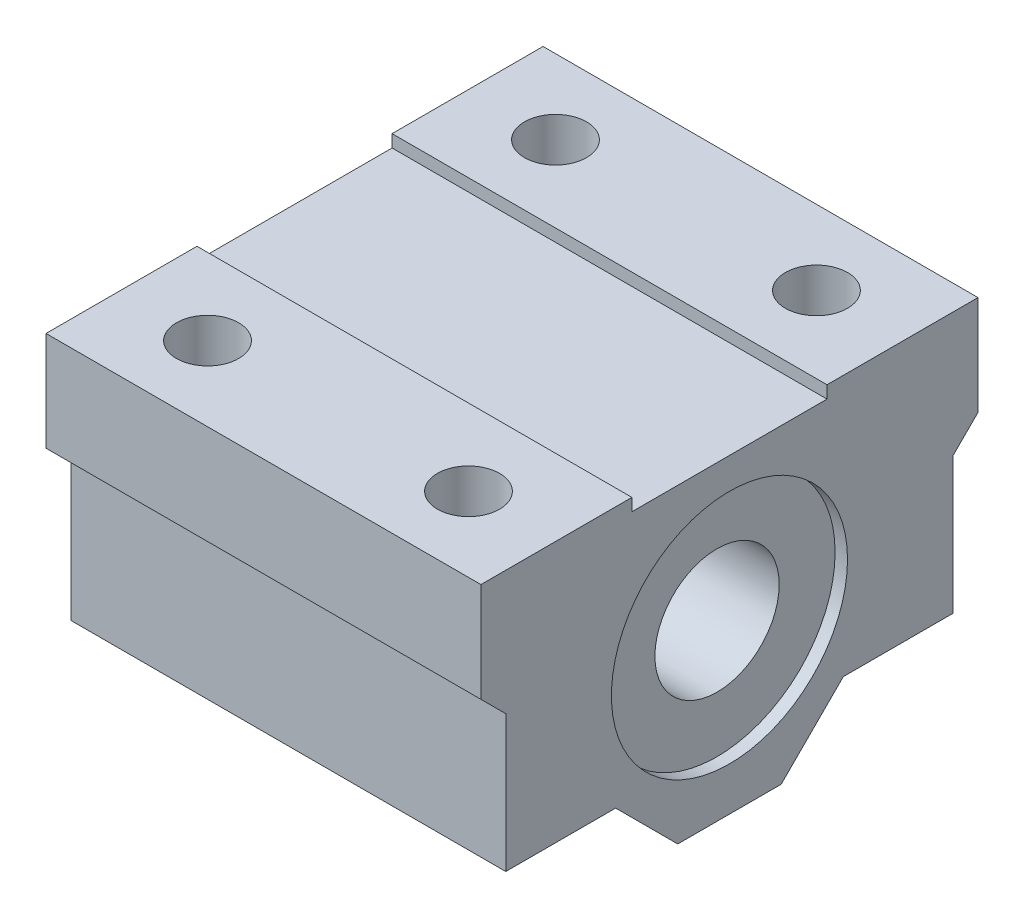
ISO-10303-21;
HEADER;
FILE_DESCRIPTION(('STEP AP214'),'2;1');
FILE_NAME('part.step','',(''),(''),'','','');
FILE_SCHEMA(('AUTOMOTIVE_DESIGN { 1 0 10303 214 1 1 1 1 }'));
ENDSEC;
DATA;
#1=APPLICATION_CONTEXT('core data for automotive mechanical design processes');
#2=APPLICATION_PROTOCOL_DEFINITION('international standard','automotive_design',2000,#1);
#3=PRODUCT_CONTEXT('',#1,'mechanical');
#4=PRODUCT('Part','Part','',(#3));
#5=PRODUCT_RELATED_PRODUCT_CATEGORY('part','',(#4));
#6=PRODUCT_DEFINITION_FORMATION('','',#4);
#7=PRODUCT_DEFINITION_CONTEXT('part definition',#1,'design');
#8=PRODUCT_DEFINITION('design','',#6,#7);
#9=PRODUCT_DEFINITION_SHAPE('','',#8);
#10=(LENGTH_UNIT() NAMED_UNIT(*) SI_UNIT(.MILLI.,.METRE.));
#11=(NAMED_UNIT(*) PLANE_ANGLE_UNIT() SI_UNIT($,.RADIAN.));
#12=(NAMED_UNIT(*) SI_UNIT($,.STERADIAN.) SOLID_ANGLE_UNIT());
#13=UNCERTAINTY_MEASURE_WITH_UNIT(LENGTH_MEASURE(1.E-05),#10,'distance_accuracy_value','');
#14=(GEOMETRIC_REPRESENTATION_CONTEXT(3) GLOBAL_UNCERTAINTY_ASSIGNED_CONTEXT((#13)) GLOBAL_UNIT_ASSIGNED_CONTEXT((#10,
#11,#12)) REPRESENTATION_CONTEXT('',''));
#15=CARTESIAN_POINT('',(0.,0.,0.));
#16=DIRECTION('',(0.,0.,1.));
#17=DIRECTION('',(1.,0.,0.));
#18=AXIS2_PLACEMENT_3D('',#15,#16,#17);
#19=CARTESIAN_POINT('',(17.5,13.,0.));
#20=DIRECTION('',(-1.,0.,0.));
#21=DIRECTION('',(0.,0.,1.));
#22=AXIS2_PLACEMENT_3D('',#19,#20,#21);
#23=CYLINDRICAL_SURFACE('',#22,5.);
#24=CARTESIAN_POINT('',(16.5,13.,0.));
#25=DIRECTION('',(1.,0.,0.));
#26=DIRECTION('',(0.,0.,-1.));
#27=AXIS2_PLACEMENT_3D('',#24,#25,#26);
#28=CIRCLE('',#27,5.);
#29=CARTESIAN_POINT('',(16.5,13.,-5.));
#30=VERTEX_POINT('',#29);
#31=EDGE_CURVE('E265',#30,#30,#28,.T.);
#32=ORIENTED_EDGE('',*,*,#31,.T.);
#33=EDGE_LOOP('',(#32));
#34=FACE_BOUND('',#33,.T.);
#35=CARTESIAN_POINT('',(-16.5,13.,0.));
#36=DIRECTION('',(-1.,0.,0.));
#37=DIRECTION('',(0.,0.,1.));
#38=AXIS2_PLACEMENT_3D('',#35,#36,#37);
#39=CIRCLE('',#38,5.);
#40=CARTESIAN_POINT('',(-16.5,13.,5.));
#41=VERTEX_POINT('',#40);
#42=EDGE_CURVE('E43',#41,#41,#39,.T.);
#43=ORIENTED_EDGE('',*,*,#42,.T.);
#44=EDGE_LOOP('',(#43));
#45=FACE_BOUND('',#44,.T.);
#46=ADVANCED_FACE('F40',(#34,#45),#23,.F.);
#47=CARTESIAN_POINT('',(-17.5,0.,0.));
#48=DIRECTION('',(1.,0.,0.));
#49=DIRECTION('',(0.,0.,-1.));
#50=AXIS2_PLACEMENT_3D('',#47,#48,#49);
#51=PLANE('',#50);
#52=DIRECTION('',(0.,0.,-1.));
#53=VECTOR('',#52,1.);
#54=CARTESIAN_POINT('',(-17.5,0.,0.));
#55=LINE('',#54,#53);
#56=CARTESIAN_POINT('',(-17.5,0.,4.16109975913342));
#57=VERTEX_POINT('',#56);
#58=CARTESIAN_POINT('',(-17.5,0.,-4.16109975913341));
#59=VERTEX_POINT('',#58);
#60=EDGE_CURVE('E185',#57,#59,#55,.T.);
#61=ORIENTED_EDGE('',*,*,#60,.F.);
#62=DIRECTION('',(0.,-0.707106781186547,-0.707106781186548));
#63=VECTOR('',#62,1.);
#64=CARTESIAN_POINT('',(-17.5,-2.08054987956671,2.08054987956671));
#65=LINE('',#64,#63);
#66=CARTESIAN_POINT('',(-17.5,5.,9.16109975913341));
#67=VERTEX_POINT('',#66);
#68=EDGE_CURVE('E116',#67,#57,#65,.T.);
#69=ORIENTED_EDGE('',*,*,#68,.F.);
#70=DIRECTION('',(0.,0.,-1.));
#71=VECTOR('',#70,1.);
#72=CARTESIAN_POINT('',(-17.5,5.,0.));
#73=LINE('',#72,#71);
#74=CARTESIAN_POINT('',(-17.5,5.,18.));
#75=VERTEX_POINT('',#74);
#76=EDGE_CURVE('E110',#75,#67,#73,.T.);
#77=ORIENTED_EDGE('',*,*,#76,.F.);
#78=DIRECTION('',(0.,-1.,0.));
#79=VECTOR('',#78,1.);
#80=CARTESIAN_POINT('',(-17.5,0.,18.));
#81=LINE('',#80,#79);
#82=CARTESIAN_POINT('',(-17.5,16.,18.));
#83=VERTEX_POINT('',#82);
#84=EDGE_CURVE('E175',#83,#75,#81,.T.);
#85=ORIENTED_EDGE('',*,*,#84,.F.);
#86=DIRECTION('',(0.,-0.707106781186546,-0.707106781186549));
#87=VECTOR('',#86,1.);
#88=CARTESIAN_POINT('',(-17.5,-0.999999999999972,0.999999999999969));
#89=LINE('',#88,#87);
#90=CARTESIAN_POINT('',(-17.5,18.,20.));
#91=VERTEX_POINT('',#90);
#92=EDGE_CURVE('E221',#91,#83,#89,.T.);
#93=ORIENTED_EDGE('',*,*,#92,.F.);
#94=DIRECTION('',(0.,-1.,0.));
#95=VECTOR('',#94,1.);
#96=CARTESIAN_POINT('',(-17.5,0.,20.));
#97=LINE('',#96,#95);
#98=CARTESIAN_POINT('',(-17.5,26.,20.));
#99=VERTEX_POINT('',#98);
#100=EDGE_CURVE('E219',#99,#91,#97,.T.);
#101=ORIENTED_EDGE('',*,*,#100,.F.);
#102=DIRECTION('',(0.,0.,-1.));
#103=VECTOR('',#102,1.);
#104=CARTESIAN_POINT('',(-17.5,26.,0.));
#105=LINE('',#104,#103);
#106=CARTESIAN_POINT('',(-17.5,26.,7.85));
#107=VERTEX_POINT('',#106);
#108=EDGE_CURVE('E216',#99,#107,#105,.T.);
#109=ORIENTED_EDGE('',*,*,#108,.T.);
#110=DIRECTION('',(0.,-1.,0.));
#111=VECTOR('',#110,1.);
#112=CARTESIAN_POINT('',(-17.5,0.,7.85000000000004));
#113=LINE('',#112,#111);
#114=CARTESIAN_POINT('',(-17.5,25.,7.85));
#115=VERTEX_POINT('',#114);
#116=EDGE_CURVE('E213',#107,#115,#113,.T.);
#117=ORIENTED_EDGE('',*,*,#116,.T.);
#118=DIRECTION('',(0.,0.,-1.));
#119=VECTOR('',#118,1.);
#120=CARTESIAN_POINT('',(-17.5,25.,0.));
#121=LINE('',#120,#119);
#122=CARTESIAN_POINT('',(-17.5,25.,-7.85));
#123=VERTEX_POINT('',#122);
#124=EDGE_CURVE('E210',#115,#123,#121,.T.);
#125=ORIENTED_EDGE('',*,*,#124,.T.);
#126=DIRECTION('',(0.,-1.,0.));
#127=VECTOR('',#126,1.);
#128=CARTESIAN_POINT('',(-17.5,0.,-7.85));
#129=LINE('',#128,#127);
#130=CARTESIAN_POINT('',(-17.5,26.,-7.85));
#131=VERTEX_POINT('',#130);
#132=EDGE_CURVE('E207',#131,#123,#129,.T.);
#133=ORIENTED_EDGE('',*,*,#132,.F.);
#134=DIRECTION('',(0.,0.,-1.));
#135=VECTOR('',#134,1.);
#136=CARTESIAN_POINT('',(-17.5,26.,0.));
#137=LINE('',#136,#135);
#138=CARTESIAN_POINT('',(-17.5,26.,-20.));
#139=VERTEX_POINT('',#138);
#140=EDGE_CURVE('E204',#131,#139,#137,.T.);
#141=ORIENTED_EDGE('',*,*,#140,.T.);
#142=DIRECTION('',(0.,-1.,0.));
#143=VECTOR('',#142,1.);
#144=CARTESIAN_POINT('',(-17.5,0.,-20.));
#145=LINE('',#144,#143);
#146=CARTESIAN_POINT('',(-17.5,18.,-20.));
#147=VERTEX_POINT('',#146);
#148=EDGE_CURVE('E201',#139,#147,#145,.T.);
#149=ORIENTED_EDGE('',*,*,#148,.T.);
#150=DIRECTION('',(0.,-0.707106781186544,0.707106781186551));
#151=VECTOR('',#150,1.);
#152=CARTESIAN_POINT('',(-17.5,-0.999999999999921,-0.99999999999991));
#153=LINE('',#152,#151);
#154=CARTESIAN_POINT('',(-17.5,16.,-18.));
#155=VERTEX_POINT('',#154);
#156=EDGE_CURVE('E198',#147,#155,#153,.T.);
#157=ORIENTED_EDGE('',*,*,#156,.T.);
#158=DIRECTION('',(0.,-1.,0.));
#159=VECTOR('',#158,1.);
#160=CARTESIAN_POINT('',(-17.5,0.,-18.));
#161=LINE('',#160,#159);
#162=CARTESIAN_POINT('',(-17.5,4.99999999999998,-18.));
#163=VERTEX_POINT('',#162);
#164=EDGE_CURVE('E195',#155,#163,#161,.T.);
#165=ORIENTED_EDGE('',*,*,#164,.T.);
#166=DIRECTION('',(0.,0.,1.));
#167=VECTOR('',#166,1.);
#168=CARTESIAN_POINT('',(-17.5,4.99999999999998,0.));
#169=LINE('',#168,#167);
#170=CARTESIAN_POINT('',(-17.5,4.99999999999998,-9.16109975913341));
#171=VERTEX_POINT('',#170);
#172=EDGE_CURVE('E192',#163,#171,#169,.T.);
#173=ORIENTED_EDGE('',*,*,#172,.T.);
#174=DIRECTION('',(0.,-0.707106781186547,0.707106781186548));
#175=VECTOR('',#174,1.);
#176=CARTESIAN_POINT('',(-17.5,-2.08054987956671,-2.08054987956671));
#177=LINE('',#176,#175);
#178=EDGE_CURVE('E188',#171,#59,#177,.T.);
#179=ORIENTED_EDGE('',*,*,#178,.T.);
#180=EDGE_LOOP('',(#61,#69,#77,#85,#93,#101,#109,#117,#125,#133,#141,#149,#157,#165,#173,#179));
#181=FACE_BOUND('',#180,.T.);
#182=CARTESIAN_POINT('',(-17.5,13.,0.));
#183=DIRECTION('',(1.,0.,0.));
#184=DIRECTION('',(0.,0.,-1.));
#185=AXIS2_PLACEMENT_3D('',#182,#183,#184);
#186=CIRCLE('',#185,9.5);
#187=CARTESIAN_POINT('',(-17.5,13.,-9.5));
#188=VERTEX_POINT('',#187);
#189=EDGE_CURVE('E282',#188,#188,#186,.T.);
#190=ORIENTED_EDGE('',*,*,#189,.T.);
#191=EDGE_LOOP('',(#190));
#192=FACE_BOUND('',#191,.T.);
#193=ADVANCED_FACE('F356',(#181,#192),#51,.F.);
#194=CARTESIAN_POINT('',(17.5,26.,0.));
#195=DIRECTION('',(0.,1.,0.));
#196=DIRECTION('',(0.,0.,1.));
#197=AXIS2_PLACEMENT_3D('',#194,#195,#196);
#198=PLANE('',#197);
#199=CARTESIAN_POINT('',(10.5,26.,-14.));
#200=DIRECTION('',(0.,1.,0.));
#201=DIRECTION('',(0.,0.,1.));
#202=AXIS2_PLACEMENT_3D('',#199,#200,#201);
#203=CIRCLE('',#202,2.5);
#204=CARTESIAN_POINT('',(10.5,26.,-11.5));
#205=VERTEX_POINT('',#204);
#206=EDGE_CURVE('E258',#205,#205,#203,.F.);
#207=ORIENTED_EDGE('',*,*,#206,.T.);
#208=EDGE_LOOP('',(#207));
#209=FACE_BOUND('',#208,.T.);
#210=ORIENTED_EDGE('',*,*,#140,.F.);
#211=DIRECTION('',(-1.,0.,0.));
#212=VECTOR('',#211,1.);
#213=CARTESIAN_POINT('',(17.5,26.,-7.85));
#214=LINE('',#213,#212);
#215=CARTESIAN_POINT('',(17.5,26.,-7.85));
#216=VERTEX_POINT('',#215);
#217=EDGE_CURVE('E240',#216,#131,#214,.T.);
#218=ORIENTED_EDGE('',*,*,#217,.F.);
#219=DIRECTION('',(0.,0.,-1.));
#220=VECTOR('',#219,1.);
#221=CARTESIAN_POINT('',(17.5,26.,0.));
#222=LINE('',#221,#220);
#223=CARTESIAN_POINT('',(17.5,26.,-20.));
#224=VERTEX_POINT('',#223);
#225=EDGE_CURVE('E329',#216,#224,#222,.T.);
#226=ORIENTED_EDGE('',*,*,#225,.T.);
#227=DIRECTION('',(-1.,0.,0.));
#228=VECTOR('',#227,1.);
#229=CARTESIAN_POINT('',(17.5,26.,-20.));
#230=LINE('',#229,#228);
#231=EDGE_CURVE('E242',#224,#139,#230,.T.);
#232=ORIENTED_EDGE('',*,*,#231,.T.);
#233=EDGE_LOOP('',(#210,#218,#226,#232));
#234=FACE_BOUND('',#233,.T.);
#235=CARTESIAN_POINT('',(-10.5,26.,-14.));
#236=DIRECTION('',(0.,1.,0.));
#237=DIRECTION('',(0.,0.,1.));
#238=AXIS2_PLACEMENT_3D('',#235,#236,#237);
#239=CIRCLE('',#238,2.5);
#240=CARTESIAN_POINT('',(-10.5,26.,-11.5));
#241=VERTEX_POINT('',#240);
#242=EDGE_CURVE('E262',#241,#241,#239,.F.);
#243=ORIENTED_EDGE('',*,*,#242,.T.);
#244=EDGE_LOOP('',(#243));
#245=FACE_BOUND('',#244,.T.);
#246=ADVANCED_FACE('F378',(#209,#234,#245),#198,.T.);
#247=CARTESIAN_POINT('',(17.5,26.,0.));
#248=DIRECTION('',(0.,1.,0.));
#249=DIRECTION('',(0.,0.,1.));
#250=AXIS2_PLACEMENT_3D('',#247,#248,#249);
#251=PLANE('',#250);
#252=CARTESIAN_POINT('',(10.5,26.,14.));
#253=DIRECTION('',(0.,1.,0.));
#254=DIRECTION('',(0.,0.,1.));
#255=AXIS2_PLACEMENT_3D('',#252,#253,#254);
#256=CIRCLE('',#255,2.5);
#257=CARTESIAN_POINT('',(10.5,26.,16.5));
#258=VERTEX_POINT('',#257);
#259=EDGE_CURVE('E189',#258,#258,#256,.F.);
#260=ORIENTED_EDGE('',*,*,#259,.T.);
#261=EDGE_LOOP('',(#260));
#262=FACE_BOUND('',#261,.T.);
#263=ORIENTED_EDGE('',*,*,#108,.F.);
#264=DIRECTION('',(-1.,0.,0.));
#265=VECTOR('',#264,1.);
#266=CARTESIAN_POINT('',(17.5,26.,20.));
#267=LINE('',#266,#265);
#268=CARTESIAN_POINT('',(17.5,26.,20.));
#269=VERTEX_POINT('',#268);
#270=EDGE_CURVE('E232',#269,#99,#267,.T.);
#271=ORIENTED_EDGE('',*,*,#270,.F.);
#272=DIRECTION('',(0.,0.,-1.));
#273=VECTOR('',#272,1.);
#274=CARTESIAN_POINT('',(17.5,26.,0.));
#275=LINE('',#274,#273);
#276=CARTESIAN_POINT('',(17.5,26.,7.85));
#277=VERTEX_POINT('',#276);
#278=EDGE_CURVE('E340',#269,#277,#275,.T.);
#279=ORIENTED_EDGE('',*,*,#278,.T.);
#280=DIRECTION('',(-1.,0.,0.));
#281=VECTOR('',#280,1.);
#282=CARTESIAN_POINT('',(17.5,26.,7.85));
#283=LINE('',#282,#281);
#284=EDGE_CURVE('E234',#277,#107,#283,.T.);
#285=ORIENTED_EDGE('',*,*,#284,.T.);
#286=EDGE_LOOP('',(#263,#271,#279,#285));
#287=FACE_BOUND('',#286,.T.);
#288=CARTESIAN_POINT('',(-10.5,26.,14.));
#289=DIRECTION('',(0.,1.,0.));
#290=DIRECTION('',(0.,0.,1.));
#291=AXIS2_PLACEMENT_3D('',#288,#289,#290);
#292=CIRCLE('',#291,2.5);
#293=CARTESIAN_POINT('',(-10.5,26.,16.5));
#294=VERTEX_POINT('',#293);
#295=EDGE_CURVE('E254',#294,#294,#292,.F.);
#296=ORIENTED_EDGE('',*,*,#295,.T.);
#297=EDGE_LOOP('',(#296));
#298=FACE_BOUND('',#297,.T.);
#299=ADVANCED_FACE('F460',(#262,#287,#298),#251,.T.);
#300=CARTESIAN_POINT('',(17.5,0.,0.));
#301=DIRECTION('',(0.,1.,0.));
#302=DIRECTION('',(0.,0.,1.));
#303=AXIS2_PLACEMENT_3D('',#300,#301,#302);
#304=PLANE('',#303);
#305=ORIENTED_EDGE('',*,*,#60,.T.);
#306=DIRECTION('',(-1.,0.,0.));
#307=VECTOR('',#306,1.);
#308=CARTESIAN_POINT('',(17.5,0.,-4.16109975913341));
#309=LINE('',#308,#307);
#310=CARTESIAN_POINT('',(17.5,0.,-4.16109975913341));
#311=VERTEX_POINT('',#310);
#312=EDGE_CURVE('E11',#311,#59,#309,.T.);
#313=ORIENTED_EDGE('',*,*,#312,.F.);
#314=DIRECTION('',(0.,0.,-1.));
#315=VECTOR('',#314,1.);
#316=CARTESIAN_POINT('',(17.5,0.,0.));
#317=LINE('',#316,#315);
#318=CARTESIAN_POINT('',(17.5,0.,4.16109975913342));
#319=VERTEX_POINT('',#318);
#320=EDGE_CURVE('E122',#319,#311,#317,.T.);
#321=ORIENTED_EDGE('',*,*,#320,.F.);
#322=DIRECTION('',(-1.,0.,0.));
#323=VECTOR('',#322,1.);
#324=CARTESIAN_POINT('',(17.5,0.,4.16109975913342));
#325=LINE('',#324,#323);
#326=EDGE_CURVE('E181',#319,#57,#325,.T.);
#327=ORIENTED_EDGE('',*,*,#326,.T.);
#328=EDGE_LOOP('',(#305,#313,#321,#327));
#329=FACE_BOUND('',#328,.T.);
#330=ADVANCED_FACE('F360',(#329),#304,.F.);
#331=CARTESIAN_POINT('',(17.5,-2.08054987956671,-2.08054987956671));
#332=DIRECTION('',(0.,-0.707106781186548,-0.707106781186547));
#333=DIRECTION('',(0.,0.707106781186547,-0.707106781186548));
#334=AXIS2_PLACEMENT_3D('',#331,#332,#333);
#335=PLANE('',#334);
#336=ORIENTED_EDGE('',*,*,#178,.F.);
#337=DIRECTION('',(-1.,0.,0.));
#338=VECTOR('',#337,1.);
#339=CARTESIAN_POINT('',(17.5,4.99999999999998,-9.16109975913341));
#340=LINE('',#339,#338);
#341=CARTESIAN_POINT('',(17.5,4.99999999999998,-9.16109975913341));
#342=VERTEX_POINT('',#341);
#343=EDGE_CURVE('E49',#342,#171,#340,.T.);
#344=ORIENTED_EDGE('',*,*,#343,.F.);
#345=DIRECTION('',(0.,-0.707106781186547,0.707106781186548));
#346=VECTOR('',#345,1.);
#347=CARTESIAN_POINT('',(17.5,-2.08054987956671,-2.08054987956671));
#348=LINE('',#347,#346);
#349=EDGE_CURVE('E314',#342,#311,#348,.T.);
#350=ORIENTED_EDGE('',*,*,#349,.T.);
#351=ORIENTED_EDGE('',*,*,#312,.T.);
#352=EDGE_LOOP('',(#336,#344,#350,#351));
#353=FACE_BOUND('',#352,.T.);
#354=ADVANCED_FACE('F503',(#353),#335,.T.);
#355=CARTESIAN_POINT('',(17.5,4.99999999999998,0.));
#356=DIRECTION('',(0.,-1.,0.));
#357=DIRECTION('',(0.,0.,-1.));
#358=AXIS2_PLACEMENT_3D('',#355,#356,#357);
#359=PLANE('',#358);
#360=CARTESIAN_POINT('',(10.5,4.99999999999998,-14.));
#361=DIRECTION('',(0.,-1.,0.));
#362=DIRECTION('',(0.,0.,-1.));
#363=AXIS2_PLACEMENT_3D('',#360,#361,#362);
#364=CIRCLE('',#363,2.15);
#365=CARTESIAN_POINT('',(10.5,4.99999999999998,-16.15));
#366=VERTEX_POINT('',#365);
#367=EDGE_CURVE('E272',#366,#366,#364,.T.);
#368=ORIENTED_EDGE('',*,*,#367,.F.);
#369=EDGE_LOOP('',(#368));
#370=FACE_BOUND('',#369,.T.);
#371=CARTESIAN_POINT('',(-10.5,4.99999999999998,-14.));
#372=DIRECTION('',(0.,-1.,0.));
#373=DIRECTION('',(0.,0.,-1.));
#374=AXIS2_PLACEMENT_3D('',#371,#372,#373);
#375=CIRCLE('',#374,2.15);
#376=CARTESIAN_POINT('',(-10.5,4.99999999999998,-16.15));
#377=VERTEX_POINT('',#376);
#378=EDGE_CURVE('E290',#377,#377,#375,.T.);
#379=ORIENTED_EDGE('',*,*,#378,.F.);
#380=EDGE_LOOP('',(#379));
#381=FACE_BOUND('',#380,.T.);
#382=ORIENTED_EDGE('',*,*,#172,.F.);
#383=DIRECTION('',(-1.,0.,0.));
#384=VECTOR('',#383,1.);
#385=CARTESIAN_POINT('',(17.5,4.99999999999998,-18.));
#386=LINE('',#385,#384);
#387=CARTESIAN_POINT('',(17.5,4.99999999999998,-18.));
#388=VERTEX_POINT('',#387);
#389=EDGE_CURVE('E248',#388,#163,#386,.T.);
#390=ORIENTED_EDGE('',*,*,#389,.F.);
#391=DIRECTION('',(0.,0.,1.));
#392=VECTOR('',#391,1.);
#393=CARTESIAN_POINT('',(17.5,4.99999999999998,0.));
#394=LINE('',#393,#392);
#395=EDGE_CURVE('E317',#388,#342,#394,.T.);
#396=ORIENTED_EDGE('',*,*,#395,.T.);
#397=ORIENTED_EDGE('',*,*,#343,.T.);
#398=EDGE_LOOP('',(#382,#390,#396,#397));
#399=FACE_BOUND('',#398,.T.);
#400=ADVANCED_FACE('F501',(#370,#381,#399),#359,.T.);
#401=CARTESIAN_POINT('',(17.5,0.,-18.));
#402=DIRECTION('',(0.,0.,-1.));
#403=DIRECTION('',(-1.,0.,0.));
#404=AXIS2_PLACEMENT_3D('',#401,#402,#403);
#405=PLANE('',#404);
#406=ORIENTED_EDGE('',*,*,#164,.F.);
#407=DIRECTION('',(-1.,0.,0.));
#408=VECTOR('',#407,1.);
#409=CARTESIAN_POINT('',(17.5,16.,-18.));
#410=LINE('',#409,#408);
#411=CARTESIAN_POINT('',(17.5,16.,-18.));
#412=VERTEX_POINT('',#411);
#413=EDGE_CURVE('E246',#412,#155,#410,.T.);
#414=ORIENTED_EDGE('',*,*,#413,.F.);
#415=DIRECTION('',(0.,-1.,0.));
#416=VECTOR('',#415,1.);
#417=CARTESIAN_POINT('',(17.5,0.,-18.));
#418=LINE('',#417,#416);
#419=EDGE_CURVE('E320',#412,#388,#418,.T.);
#420=ORIENTED_EDGE('',*,*,#419,.T.);
#421=ORIENTED_EDGE('',*,*,#389,.T.);
#422=EDGE_LOOP('',(#406,#414,#420,#421));
#423=FACE_BOUND('',#422,.T.);
#424=ADVANCED_FACE('F497',(#423),#405,.T.);
#425=CARTESIAN_POINT('',(17.5,-0.999999999999921,-0.99999999999991));
#426=DIRECTION('',(0.,-0.707106781186551,-0.707106781186544));
#427=DIRECTION('',(0.,0.707106781186544,-0.707106781186551));
#428=AXIS2_PLACEMENT_3D('',#425,#426,#427);
#429=PLANE('',#428);
#430=ORIENTED_EDGE('',*,*,#156,.F.);
#431=DIRECTION('',(-1.,0.,0.));
#432=VECTOR('',#431,1.);
#433=CARTESIAN_POINT('',(17.5,18.,-20.));
#434=LINE('',#433,#432);
#435=CARTESIAN_POINT('',(17.5,18.,-20.));
#436=VERTEX_POINT('',#435);
#437=EDGE_CURVE('E244',#436,#147,#434,.T.);
#438=ORIENTED_EDGE('',*,*,#437,.F.);
#439=DIRECTION('',(0.,-0.707106781186544,0.707106781186551));
#440=VECTOR('',#439,1.);
#441=CARTESIAN_POINT('',(17.5,-0.999999999999921,-0.99999999999991));
#442=LINE('',#441,#440);
#443=EDGE_CURVE('E323',#436,#412,#442,.T.);
#444=ORIENTED_EDGE('',*,*,#443,.T.);
#445=ORIENTED_EDGE('',*,*,#413,.T.);
#446=EDGE_LOOP('',(#430,#438,#444,#445));
#447=FACE_BOUND('',#446,.T.);
#448=ADVANCED_FACE('F493',(#447),#429,.T.);
#449=CARTESIAN_POINT('',(17.5,0.,-20.));
#450=DIRECTION('',(0.,0.,-1.));
#451=DIRECTION('',(-1.,0.,0.));
#452=AXIS2_PLACEMENT_3D('',#449,#450,#451);
#453=PLANE('',#452);
#454=ORIENTED_EDGE('',*,*,#148,.F.);
#455=ORIENTED_EDGE('',*,*,#231,.F.);
#456=DIRECTION('',(0.,-1.,0.));
#457=VECTOR('',#456,1.);
#458=CARTESIAN_POINT('',(17.5,0.,-20.));
#459=LINE('',#458,#457);
#460=EDGE_CURVE('E326',#224,#436,#459,.T.);
#461=ORIENTED_EDGE('',*,*,#460,.T.);
#462=ORIENTED_EDGE('',*,*,#437,.T.);
#463=EDGE_LOOP('',(#454,#455,#461,#462));
#464=FACE_BOUND('',#463,.T.);
#465=ADVANCED_FACE('F489',(#464),#453,.T.);
#466=CARTESIAN_POINT('',(17.5,0.,-7.85));
#467=DIRECTION('',(0.,0.,-1.));
#468=DIRECTION('',(-1.,0.,0.));
#469=AXIS2_PLACEMENT_3D('',#466,#467,#468);
#470=PLANE('',#469);
#471=ORIENTED_EDGE('',*,*,#132,.T.);
#472=DIRECTION('',(-1.,0.,0.));
#473=VECTOR('',#472,1.);
#474=CARTESIAN_POINT('',(17.5,25.,-7.85));
#475=LINE('',#474,#473);
#476=CARTESIAN_POINT('',(17.5,25.,-7.85));
#477=VERTEX_POINT('',#476);
#478=EDGE_CURVE('E238',#477,#123,#475,.T.);
#479=ORIENTED_EDGE('',*,*,#478,.F.);
#480=DIRECTION('',(0.,-1.,0.));
#481=VECTOR('',#480,1.);
#482=CARTESIAN_POINT('',(17.5,0.,-7.85));
#483=LINE('',#482,#481);
#484=EDGE_CURVE('E332',#216,#477,#483,.T.);
#485=ORIENTED_EDGE('',*,*,#484,.F.);
#486=ORIENTED_EDGE('',*,*,#217,.T.);
#487=EDGE_LOOP('',(#471,#479,#485,#486));
#488=FACE_BOUND('',#487,.T.);
#489=ADVANCED_FACE('F481',(#488),#470,.F.);
#490=CARTESIAN_POINT('',(17.5,25.,0.));
#491=DIRECTION('',(0.,1.,0.));
#492=DIRECTION('',(0.,0.,1.));
#493=AXIS2_PLACEMENT_3D('',#490,#491,#492);
#494=PLANE('',#493);
#495=ORIENTED_EDGE('',*,*,#124,.F.);
#496=DIRECTION('',(-1.,0.,0.));
#497=VECTOR('',#496,1.);
#498=CARTESIAN_POINT('',(17.5,25.,7.85));
#499=LINE('',#498,#497);
#500=CARTESIAN_POINT('',(17.5,25.,7.85));
#501=VERTEX_POINT('',#500);
#502=EDGE_CURVE('E236',#501,#115,#499,.T.);
#503=ORIENTED_EDGE('',*,*,#502,.F.);
#504=DIRECTION('',(0.,0.,-1.));
#505=VECTOR('',#504,1.);
#506=CARTESIAN_POINT('',(17.5,25.,0.));
#507=LINE('',#506,#505);
#508=EDGE_CURVE('E334',#501,#477,#507,.T.);
#509=ORIENTED_EDGE('',*,*,#508,.T.);
#510=ORIENTED_EDGE('',*,*,#478,.T.);
#511=EDGE_LOOP('',(#495,#503,#509,#510));
#512=FACE_BOUND('',#511,.T.);
#513=ADVANCED_FACE('F477',(#512),#494,.T.);
#514=CARTESIAN_POINT('',(17.5,0.,7.85000000000004));
#515=DIRECTION('',(0.,0.,-1.));
#516=DIRECTION('',(0.,1.,0.));
#517=AXIS2_PLACEMENT_3D('',#514,#515,#516);
#518=PLANE('',#517);
#519=ORIENTED_EDGE('',*,*,#116,.F.);
#520=ORIENTED_EDGE('',*,*,#284,.F.);
#521=DIRECTION('',(0.,-1.,0.));
#522=VECTOR('',#521,1.);
#523=CARTESIAN_POINT('',(17.5,0.,7.85000000000004));
#524=LINE('',#523,#522);
#525=EDGE_CURVE('E337',#277,#501,#524,.T.);
#526=ORIENTED_EDGE('',*,*,#525,.T.);
#527=ORIENTED_EDGE('',*,*,#502,.T.);
#528=EDGE_LOOP('',(#519,#520,#526,#527));
#529=FACE_BOUND('',#528,.T.);
#530=ADVANCED_FACE('F474',(#529),#518,.T.);
#531=CARTESIAN_POINT('',(17.5,0.,20.));
#532=DIRECTION('',(0.,0.,-1.));
#533=DIRECTION('',(-1.,0.,0.));
#534=AXIS2_PLACEMENT_3D('',#531,#532,#533);
#535=PLANE('',#534);
#536=ORIENTED_EDGE('',*,*,#100,.T.);
#537=DIRECTION('',(-1.,0.,0.));
#538=VECTOR('',#537,1.);
#539=CARTESIAN_POINT('',(17.5,18.,20.));
#540=LINE('',#539,#538);
#541=CARTESIAN_POINT('',(17.5,18.,20.));
#542=VERTEX_POINT('',#541);
#543=EDGE_CURVE('E229',#542,#91,#540,.T.);
#544=ORIENTED_EDGE('',*,*,#543,.F.);
#545=DIRECTION('',(0.,-1.,0.));
#546=VECTOR('',#545,1.);
#547=CARTESIAN_POINT('',(17.5,0.,20.));
#548=LINE('',#547,#546);
#549=EDGE_CURVE('E343',#269,#542,#548,.T.);
#550=ORIENTED_EDGE('',*,*,#549,.F.);
#551=ORIENTED_EDGE('',*,*,#270,.T.);
#552=EDGE_LOOP('',(#536,#544,#550,#551));
#553=FACE_BOUND('',#552,.T.);
#554=ADVANCED_FACE('F349',(#553),#535,.F.);
#555=CARTESIAN_POINT('',(17.5,-0.999999999999972,0.999999999999969));
#556=DIRECTION('',(0.,0.707106781186549,-0.707106781186546));
#557=DIRECTION('',(0.,0.707106781186546,0.707106781186549));
#558=AXIS2_PLACEMENT_3D('',#555,#556,#557);
#559=PLANE('',#558);
#560=ORIENTED_EDGE('',*,*,#92,.T.);
#561=DIRECTION('',(-1.,0.,0.));
#562=VECTOR('',#561,1.);
#563=CARTESIAN_POINT('',(17.5,16.,18.));
#564=LINE('',#563,#562);
#565=CARTESIAN_POINT('',(17.5,16.,18.));
#566=VERTEX_POINT('',#565);
#567=EDGE_CURVE('E176',#566,#83,#564,.T.);
#568=ORIENTED_EDGE('',*,*,#567,.F.);
#569=DIRECTION('',(0.,-0.707106781186546,-0.707106781186549));
#570=VECTOR('',#569,1.);
#571=CARTESIAN_POINT('',(17.5,-0.999999999999972,0.999999999999969));
#572=LINE('',#571,#570);
#573=EDGE_CURVE('E167',#542,#566,#572,.T.);
#574=ORIENTED_EDGE('',*,*,#573,.F.);
#575=ORIENTED_EDGE('',*,*,#543,.T.);
#576=EDGE_LOOP('',(#560,#568,#574,#575));
#577=FACE_BOUND('',#576,.T.);
#578=ADVANCED_FACE('F353',(#577),#559,.F.);
#579=CARTESIAN_POINT('',(17.5,0.,18.));
#580=DIRECTION('',(0.,0.,-1.));
#581=DIRECTION('',(-1.,0.,0.));
#582=AXIS2_PLACEMENT_3D('',#579,#580,#581);
#583=PLANE('',#582);
#584=ORIENTED_EDGE('',*,*,#84,.T.);
#585=DIRECTION('',(-1.,0.,0.));
#586=VECTOR('',#585,1.);
#587=CARTESIAN_POINT('',(17.5,5.,18.));
#588=LINE('',#587,#586);
#589=CARTESIAN_POINT('',(17.5,5.,18.));
#590=VERTEX_POINT('',#589);
#591=EDGE_CURVE('E172',#590,#75,#588,.T.);
#592=ORIENTED_EDGE('',*,*,#591,.F.);
#593=DIRECTION('',(0.,-1.,0.));
#594=VECTOR('',#593,1.);
#595=CARTESIAN_POINT('',(17.5,0.,18.));
#596=LINE('',#595,#594);
#597=EDGE_CURVE('E161',#566,#590,#596,.T.);
#598=ORIENTED_EDGE('',*,*,#597,.F.);
#599=ORIENTED_EDGE('',*,*,#567,.T.);
#600=EDGE_LOOP('',(#584,#592,#598,#599));
#601=FACE_BOUND('',#600,.T.);
#602=ADVANCED_FACE('F173',(#601),#583,.F.);
#603=CARTESIAN_POINT('',(17.5,5.,0.));
#604=DIRECTION('',(0.,1.,0.));
#605=DIRECTION('',(0.,0.,1.));
#606=AXIS2_PLACEMENT_3D('',#603,#604,#605);
#607=PLANE('',#606);
#608=CARTESIAN_POINT('',(-10.5,5.,14.));
#609=DIRECTION('',(0.,1.,0.));
#610=DIRECTION('',(0.,0.,1.));
#611=AXIS2_PLACEMENT_3D('',#608,#609,#610);
#612=CIRCLE('',#611,2.15);
#613=CARTESIAN_POINT('',(-10.5,5.,16.15));
#614=VERTEX_POINT('',#613);
#615=EDGE_CURVE('E296',#614,#614,#612,.T.);
#616=ORIENTED_EDGE('',*,*,#615,.T.);
#617=EDGE_LOOP('',(#616));
#618=FACE_BOUND('',#617,.T.);
#619=CARTESIAN_POINT('',(10.5,5.,14.));
#620=DIRECTION('',(0.,1.,0.));
#621=DIRECTION('',(0.,0.,1.));
#622=AXIS2_PLACEMENT_3D('',#619,#620,#621);
#623=CIRCLE('',#622,2.15);
#624=CARTESIAN_POINT('',(10.5,5.,16.15));
#625=VERTEX_POINT('',#624);
#626=EDGE_CURVE('E302',#625,#625,#623,.T.);
#627=ORIENTED_EDGE('',*,*,#626,.T.);
#628=EDGE_LOOP('',(#627));
#629=FACE_BOUND('',#628,.T.);
#630=ORIENTED_EDGE('',*,*,#76,.T.);
#631=DIRECTION('',(-1.,0.,0.));
#632=VECTOR('',#631,1.);
#633=CARTESIAN_POINT('',(17.5,5.,9.16109975913341));
#634=LINE('',#633,#632);
#635=CARTESIAN_POINT('',(17.5,5.,9.16109975913341));
#636=VERTEX_POINT('',#635);
#637=EDGE_CURVE('E177',#636,#67,#634,.T.);
#638=ORIENTED_EDGE('',*,*,#637,.F.);
#639=DIRECTION('',(0.,0.,-1.));
#640=VECTOR('',#639,1.);
#641=CARTESIAN_POINT('',(17.5,5.,0.));
#642=LINE('',#641,#640);
#643=EDGE_CURVE('E165',#590,#636,#642,.T.);
#644=ORIENTED_EDGE('',*,*,#643,.F.);
#645=ORIENTED_EDGE('',*,*,#591,.T.);
#646=EDGE_LOOP('',(#630,#638,#644,#645));
#647=FACE_BOUND('',#646,.T.);
#648=ADVANCED_FACE('F179',(#618,#629,#647),#607,.F.);
#649=CARTESIAN_POINT('',(17.5,-2.08054987956671,2.08054987956671));
#650=DIRECTION('',(0.,0.707106781186548,-0.707106781186547));
#651=DIRECTION('',(0.,0.707106781186547,0.707106781186548));
#652=AXIS2_PLACEMENT_3D('',#649,#650,#651);
#653=PLANE('',#652);
#654=ORIENTED_EDGE('',*,*,#68,.T.);
#655=ORIENTED_EDGE('',*,*,#326,.F.);
#656=DIRECTION('',(0.,-0.707106781186547,-0.707106781186548));
#657=VECTOR('',#656,1.);
#658=CARTESIAN_POINT('',(17.5,-2.08054987956671,2.08054987956671));
#659=LINE('',#658,#657);
#660=EDGE_CURVE('E58',#636,#319,#659,.T.);
#661=ORIENTED_EDGE('',*,*,#660,.F.);
#662=ORIENTED_EDGE('',*,*,#637,.T.);
#663=EDGE_LOOP('',(#654,#655,#661,#662));
#664=FACE_BOUND('',#663,.T.);
#665=ADVANCED_FACE('F361',(#664),#653,.F.);
#666=CARTESIAN_POINT('',(17.5,0.,0.));
#667=DIRECTION('',(1.,0.,0.));
#668=DIRECTION('',(0.,0.,-1.));
#669=AXIS2_PLACEMENT_3D('',#666,#667,#668);
#670=PLANE('',#669);
#671=CARTESIAN_POINT('',(17.5,13.,0.));
#672=DIRECTION('',(1.,0.,0.));
#673=DIRECTION('',(0.,0.,-1.));
#674=AXIS2_PLACEMENT_3D('',#671,#672,#673);
#675=CIRCLE('',#674,9.5);
#676=CARTESIAN_POINT('',(17.5,13.,-9.5));
#677=VERTEX_POINT('',#676);
#678=EDGE_CURVE('E275',#677,#677,#675,.T.);
#679=ORIENTED_EDGE('',*,*,#678,.F.);
#680=EDGE_LOOP('',(#679));
#681=FACE_BOUND('',#680,.T.);
#682=ORIENTED_EDGE('',*,*,#320,.T.);
#683=ORIENTED_EDGE('',*,*,#349,.F.);
#684=ORIENTED_EDGE('',*,*,#395,.F.);
#685=ORIENTED_EDGE('',*,*,#419,.F.);
#686=ORIENTED_EDGE('',*,*,#443,.F.);
#687=ORIENTED_EDGE('',*,*,#460,.F.);
#688=ORIENTED_EDGE('',*,*,#225,.F.);
#689=ORIENTED_EDGE('',*,*,#484,.T.);
#690=ORIENTED_EDGE('',*,*,#508,.F.);
#691=ORIENTED_EDGE('',*,*,#525,.F.);
#692=ORIENTED_EDGE('',*,*,#278,.F.);
#693=ORIENTED_EDGE('',*,*,#549,.T.);
#694=ORIENTED_EDGE('',*,*,#573,.T.);
#695=ORIENTED_EDGE('',*,*,#597,.T.);
#696=ORIENTED_EDGE('',*,*,#643,.T.);
#697=ORIENTED_EDGE('',*,*,#660,.T.);
#698=EDGE_LOOP('',(#682,#683,#684,#685,#686,#687,#688,#689,#690,#691,#692,#693,#694,#695,#696,#697));
#699=FACE_BOUND('',#698,.T.);
#700=ADVANCED_FACE('F163',(#681,#699),#670,.T.);
#701=CARTESIAN_POINT('',(10.5,34.,14.));
#702=DIRECTION('',(0.,-1.,0.));
#703=DIRECTION('',(0.,0.,-1.));
#704=AXIS2_PLACEMENT_3D('',#701,#702,#703);
#705=CYLINDRICAL_SURFACE('',#704,2.5);
#706=ORIENTED_EDGE('',*,*,#259,.F.);
#707=EDGE_LOOP('',(#706));
#708=FACE_BOUND('',#707,.T.);
#709=CARTESIAN_POINT('',(10.5,18.,14.));
#710=DIRECTION('',(0.,1.,0.));
#711=DIRECTION('',(0.,0.,1.));
#712=AXIS2_PLACEMENT_3D('',#709,#710,#711);
#713=CIRCLE('',#712,2.5);
#714=CARTESIAN_POINT('',(10.5,18.,16.5));
#715=VERTEX_POINT('',#714);
#716=EDGE_CURVE('E253',#715,#715,#713,.T.);
#717=ORIENTED_EDGE('',*,*,#716,.F.);
#718=EDGE_LOOP('',(#717));
#719=FACE_BOUND('',#718,.T.);
#720=ADVANCED_FACE('F368',(#708,#719),#705,.F.);
#721=CARTESIAN_POINT('',(10.5,18.,14.));
#722=DIRECTION('',(0.,1.,0.));
#723=DIRECTION('',(0.,0.,1.));
#724=AXIS2_PLACEMENT_3D('',#721,#722,#723);
#725=PLANE('',#724);
#726=CARTESIAN_POINT('',(10.5,18.,14.));
#727=DIRECTION('',(0.,1.,0.));
#728=DIRECTION('',(0.,0.,1.));
#729=AXIS2_PLACEMENT_3D('',#726,#727,#728);
#730=CIRCLE('',#729,2.15);
#731=CARTESIAN_POINT('',(10.5,18.,16.15));
#732=VERTEX_POINT('',#731);
#733=EDGE_CURVE('E299',#732,#732,#730,.T.);
#734=ORIENTED_EDGE('',*,*,#733,.F.);
#735=EDGE_LOOP('',(#734));
#736=FACE_BOUND('',#735,.T.);
#737=ORIENTED_EDGE('',*,*,#716,.T.);
#738=EDGE_LOOP('',(#737));
#739=FACE_BOUND('',#738,.T.);
#740=ADVANCED_FACE('F446',(#736,#739),#725,.T.);
#741=CARTESIAN_POINT('',(-10.5,34.,14.));
#742=DIRECTION('',(0.,-1.,0.));
#743=DIRECTION('',(0.,0.,-1.));
#744=AXIS2_PLACEMENT_3D('',#741,#742,#743);
#745=CYLINDRICAL_SURFACE('',#744,2.5);
#746=ORIENTED_EDGE('',*,*,#295,.F.);
#747=EDGE_LOOP('',(#746));
#748=FACE_BOUND('',#747,.T.);
#749=CARTESIAN_POINT('',(-10.5,18.,14.));
#750=DIRECTION('',(0.,1.,0.));
#751=DIRECTION('',(0.,0.,1.));
#752=AXIS2_PLACEMENT_3D('',#749,#750,#751);
#753=CIRCLE('',#752,2.5);
#754=CARTESIAN_POINT('',(-10.5,18.,16.5));
#755=VERTEX_POINT('',#754);
#756=EDGE_CURVE('E257',#755,#755,#753,.T.);
#757=ORIENTED_EDGE('',*,*,#756,.F.);
#758=EDGE_LOOP('',(#757));
#759=FACE_BOUND('',#758,.T.);
#760=ADVANCED_FACE('F442',(#748,#759),#745,.F.);
#761=CARTESIAN_POINT('',(-10.5,18.,14.));
#762=DIRECTION('',(0.,1.,0.));
#763=DIRECTION('',(0.,0.,1.));
#764=AXIS2_PLACEMENT_3D('',#761,#762,#763);
#765=PLANE('',#764);
#766=CARTESIAN_POINT('',(-10.5,18.,14.));
#767=DIRECTION('',(0.,1.,0.));
#768=DIRECTION('',(0.,0.,1.));
#769=AXIS2_PLACEMENT_3D('',#766,#767,#768);
#770=CIRCLE('',#769,2.15);
#771=CARTESIAN_POINT('',(-10.5,18.,16.15));
#772=VERTEX_POINT('',#771);
#773=EDGE_CURVE('E293',#772,#772,#770,.T.);
#774=ORIENTED_EDGE('',*,*,#773,.F.);
#775=EDGE_LOOP('',(#774));
#776=FACE_BOUND('',#775,.T.);
#777=ORIENTED_EDGE('',*,*,#756,.T.);
#778=EDGE_LOOP('',(#777));
#779=FACE_BOUND('',#778,.T.);
#780=ADVANCED_FACE('F438',(#776,#779),#765,.T.);
#781=CARTESIAN_POINT('',(10.5,34.,-14.));
#782=DIRECTION('',(0.,-1.,0.));
#783=DIRECTION('',(0.,0.,-1.));
#784=AXIS2_PLACEMENT_3D('',#781,#782,#783);
#785=CYLINDRICAL_SURFACE('',#784,2.5);
#786=ORIENTED_EDGE('',*,*,#206,.F.);
#787=EDGE_LOOP('',(#786));
#788=FACE_BOUND('',#787,.T.);
#789=CARTESIAN_POINT('',(10.5,18.,-14.));
#790=DIRECTION('',(0.,1.,0.));
#791=DIRECTION('',(0.,0.,1.));
#792=AXIS2_PLACEMENT_3D('',#789,#790,#791);
#793=CIRCLE('',#792,2.5);
#794=CARTESIAN_POINT('',(10.5,18.,-11.5));
#795=VERTEX_POINT('',#794);
#796=EDGE_CURVE('E261',#795,#795,#793,.T.);
#797=ORIENTED_EDGE('',*,*,#796,.F.);
#798=EDGE_LOOP('',(#797));
#799=FACE_BOUND('',#798,.T.);
#800=ADVANCED_FACE('F434',(#788,#799),#785,.F.);
#801=CARTESIAN_POINT('',(10.5,18.,-14.));
#802=DIRECTION('',(0.,1.,0.));
#803=DIRECTION('',(0.,0.,1.));
#804=AXIS2_PLACEMENT_3D('',#801,#802,#803);
#805=PLANE('',#804);
#806=CARTESIAN_POINT('',(10.5,18.,-14.));
#807=DIRECTION('',(0.,1.,0.));
#808=DIRECTION('',(0.,0.,1.));
#809=AXIS2_PLACEMENT_3D('',#806,#807,#808);
#810=CIRCLE('',#809,2.15);
#811=CARTESIAN_POINT('',(10.5,18.,-11.85));
#812=VERTEX_POINT('',#811);
#813=EDGE_CURVE('E267',#812,#812,#810,.T.);
#814=ORIENTED_EDGE('',*,*,#813,.F.);
#815=EDGE_LOOP('',(#814));
#816=FACE_BOUND('',#815,.T.);
#817=ORIENTED_EDGE('',*,*,#796,.T.);
#818=EDGE_LOOP('',(#817));
#819=FACE_BOUND('',#818,.T.);
#820=ADVANCED_FACE('F430',(#816,#819),#805,.T.);
#821=CARTESIAN_POINT('',(-10.5,34.,-14.));
#822=DIRECTION('',(0.,-1.,0.));
#823=DIRECTION('',(0.,0.,-1.));
#824=AXIS2_PLACEMENT_3D('',#821,#822,#823);
#825=CYLINDRICAL_SURFACE('',#824,2.5);
#826=ORIENTED_EDGE('',*,*,#242,.F.);
#827=EDGE_LOOP('',(#826));
#828=FACE_BOUND('',#827,.T.);
#829=CARTESIAN_POINT('',(-10.5,18.,-14.));
#830=DIRECTION('',(0.,1.,0.));
#831=DIRECTION('',(0.,0.,1.));
#832=AXIS2_PLACEMENT_3D('',#829,#830,#831);
#833=CIRCLE('',#832,2.5);
#834=CARTESIAN_POINT('',(-10.5,18.,-11.5));
#835=VERTEX_POINT('',#834);
#836=EDGE_CURVE('E264',#835,#835,#833,.T.);
#837=ORIENTED_EDGE('',*,*,#836,.F.);
#838=EDGE_LOOP('',(#837));
#839=FACE_BOUND('',#838,.T.);
#840=ADVANCED_FACE('F426',(#828,#839),#825,.F.);
#841=CARTESIAN_POINT('',(-10.5,18.,-14.));
#842=DIRECTION('',(0.,1.,0.));
#843=DIRECTION('',(0.,0.,1.));
#844=AXIS2_PLACEMENT_3D('',#841,#842,#843);
#845=PLANE('',#844);
#846=CARTESIAN_POINT('',(-10.5,18.,-14.));
#847=DIRECTION('',(0.,1.,0.));
#848=DIRECTION('',(0.,0.,1.));
#849=AXIS2_PLACEMENT_3D('',#846,#847,#848);
#850=CIRCLE('',#849,2.15);
#851=CARTESIAN_POINT('',(-10.5,18.,-11.85));
#852=VERTEX_POINT('',#851);
#853=EDGE_CURVE('E287',#852,#852,#850,.T.);
#854=ORIENTED_EDGE('',*,*,#853,.F.);
#855=EDGE_LOOP('',(#854));
#856=FACE_BOUND('',#855,.T.);
#857=ORIENTED_EDGE('',*,*,#836,.T.);
#858=EDGE_LOOP('',(#857));
#859=FACE_BOUND('',#858,.T.);
#860=ADVANCED_FACE('F422',(#856,#859),#845,.T.);
#861=CARTESIAN_POINT('',(10.5,-8.00000000000002,14.));
#862=DIRECTION('',(0.,1.,0.));
#863=DIRECTION('',(0.,0.,1.));
#864=AXIS2_PLACEMENT_3D('',#861,#862,#863);
#865=CYLINDRICAL_SURFACE('',#864,2.15);
#866=ORIENTED_EDGE('',*,*,#733,.T.);
#867=EDGE_LOOP('',(#866));
#868=FACE_BOUND('',#867,.T.);
#869=ORIENTED_EDGE('',*,*,#626,.F.);
#870=EDGE_LOOP('',(#869));
#871=FACE_BOUND('',#870,.T.);
#872=ADVANCED_FACE('F418',(#868,#871),#865,.F.);
#873=CARTESIAN_POINT('',(-10.5,-8.00000000000002,14.));
#874=DIRECTION('',(0.,1.,0.));
#875=DIRECTION('',(0.,0.,1.));
#876=AXIS2_PLACEMENT_3D('',#873,#874,#875);
#877=CYLINDRICAL_SURFACE('',#876,2.15);
#878=ORIENTED_EDGE('',*,*,#773,.T.);
#879=EDGE_LOOP('',(#878));
#880=FACE_BOUND('',#879,.T.);
#881=ORIENTED_EDGE('',*,*,#615,.F.);
#882=EDGE_LOOP('',(#881));
#883=FACE_BOUND('',#882,.T.);
#884=ADVANCED_FACE('F414',(#880,#883),#877,.F.);
#885=CARTESIAN_POINT('',(-10.5,-8.00000000000002,-14.));
#886=DIRECTION('',(0.,1.,0.));
#887=DIRECTION('',(0.,0.,1.));
#888=AXIS2_PLACEMENT_3D('',#885,#886,#887);
#889=CYLINDRICAL_SURFACE('',#888,2.15);
#890=ORIENTED_EDGE('',*,*,#378,.T.);
#891=EDGE_LOOP('',(#890));
#892=FACE_BOUND('',#891,.T.);
#893=ORIENTED_EDGE('',*,*,#853,.T.);
#894=EDGE_LOOP('',(#893));
#895=FACE_BOUND('',#894,.T.);
#896=ADVANCED_FACE('F410',(#892,#895),#889,.F.);
#897=CARTESIAN_POINT('',(10.5,-8.00000000000002,-14.));
#898=DIRECTION('',(0.,1.,0.));
#899=DIRECTION('',(0.,0.,1.));
#900=AXIS2_PLACEMENT_3D('',#897,#898,#899);
#901=CYLINDRICAL_SURFACE('',#900,2.15);
#902=ORIENTED_EDGE('',*,*,#367,.T.);
#903=EDGE_LOOP('',(#902));
#904=FACE_BOUND('',#903,.T.);
#905=ORIENTED_EDGE('',*,*,#813,.T.);
#906=EDGE_LOOP('',(#905));
#907=FACE_BOUND('',#906,.T.);
#908=ADVANCED_FACE('F406',(#904,#907),#901,.F.);
#909=CARTESIAN_POINT('',(16.5,13.,0.));
#910=DIRECTION('',(1.,0.,0.));
#911=DIRECTION('',(0.,0.,-1.));
#912=AXIS2_PLACEMENT_3D('',#909,#910,#911);
#913=CYLINDRICAL_SURFACE('',#912,9.5);
#914=CARTESIAN_POINT('',(16.5,13.,0.));
#915=DIRECTION('',(1.,0.,0.));
#916=DIRECTION('',(0.,0.,-1.));
#917=AXIS2_PLACEMENT_3D('',#914,#915,#916);
#918=CIRCLE('',#917,9.5);
#919=CARTESIAN_POINT('',(16.5,13.,-9.5));
#920=VERTEX_POINT('',#919);
#921=EDGE_CURVE('E268',#920,#920,#918,.T.);
#922=ORIENTED_EDGE('',*,*,#921,.F.);
#923=EDGE_LOOP('',(#922));
#924=FACE_BOUND('',#923,.T.);
#925=ORIENTED_EDGE('',*,*,#678,.T.);
#926=EDGE_LOOP('',(#925));
#927=FACE_BOUND('',#926,.T.);
#928=ADVANCED_FACE('F400',(#924,#927),#913,.F.);
#929=CARTESIAN_POINT('',(16.5,13.,0.));
#930=DIRECTION('',(1.,0.,0.));
#931=DIRECTION('',(0.,0.,-1.));
#932=AXIS2_PLACEMENT_3D('',#929,#930,#931);
#933=PLANE('',#932);
#934=ORIENTED_EDGE('',*,*,#31,.F.);
#935=EDGE_LOOP('',(#934));
#936=FACE_BOUND('',#935,.T.);
#937=ORIENTED_EDGE('',*,*,#921,.T.);
#938=EDGE_LOOP('',(#937));
#939=FACE_BOUND('',#938,.T.);
#940=ADVANCED_FACE('F393',(#936,#939),#933,.T.);
#941=CARTESIAN_POINT('',(-16.5,13.,0.));
#942=DIRECTION('',(-1.,0.,0.));
#943=DIRECTION('',(0.,0.,1.));
#944=AXIS2_PLACEMENT_3D('',#941,#942,#943);
#945=CYLINDRICAL_SURFACE('',#944,9.5);
#946=CARTESIAN_POINT('',(-16.5,13.,0.));
#947=DIRECTION('',(1.,0.,0.));
#948=DIRECTION('',(0.,0.,-1.));
#949=AXIS2_PLACEMENT_3D('',#946,#947,#948);
#950=CIRCLE('',#949,9.5);
#951=CARTESIAN_POINT('',(-16.5,13.,-9.5));
#952=VERTEX_POINT('',#951);
#953=EDGE_CURVE('E383',#952,#952,#950,.T.);
#954=ORIENTED_EDGE('',*,*,#953,.T.);
#955=EDGE_LOOP('',(#954));
#956=FACE_BOUND('',#955,.T.);
#957=ORIENTED_EDGE('',*,*,#189,.F.);
#958=EDGE_LOOP('',(#957));
#959=FACE_BOUND('',#958,.T.);
#960=ADVANCED_FACE('F390',(#956,#959),#945,.F.);
#961=CARTESIAN_POINT('',(-16.5,13.,0.));
#962=DIRECTION('',(-1.,0.,0.));
#963=DIRECTION('',(0.,0.,-1.));
#964=AXIS2_PLACEMENT_3D('',#961,#962,#963);
#965=PLANE('',#964);
#966=ORIENTED_EDGE('',*,*,#42,.F.);
#967=EDGE_LOOP('',(#966));
#968=FACE_BOUND('',#967,.T.);
#969=ORIENTED_EDGE('',*,*,#953,.F.);
#970=EDGE_LOOP('',(#969));
#971=FACE_BOUND('',#970,.T.);
#972=ADVANCED_FACE('F392',(#968,#971),#965,.T.);
#973=CLOSED_SHELL('',(#46,#193,#246,#299,#330,#354,#400,#424,#448,#465,#489,#513,#530,#554,#578,
#602,#648,#665,#700,#720,#740,#760,#780,#800,#820,#840,#860,#872,#884,#896,#908,#928,#940,#960,#972));
#974=MANIFOLD_SOLID_BREP('B2',#973);
#975=ADVANCED_BREP_SHAPE_REPRESENTATION('',(#18,#974),#14);
#976=SHAPE_DEFINITION_REPRESENTATION(#9,#975);
ENDSEC;
END-ISO-10303-21;
